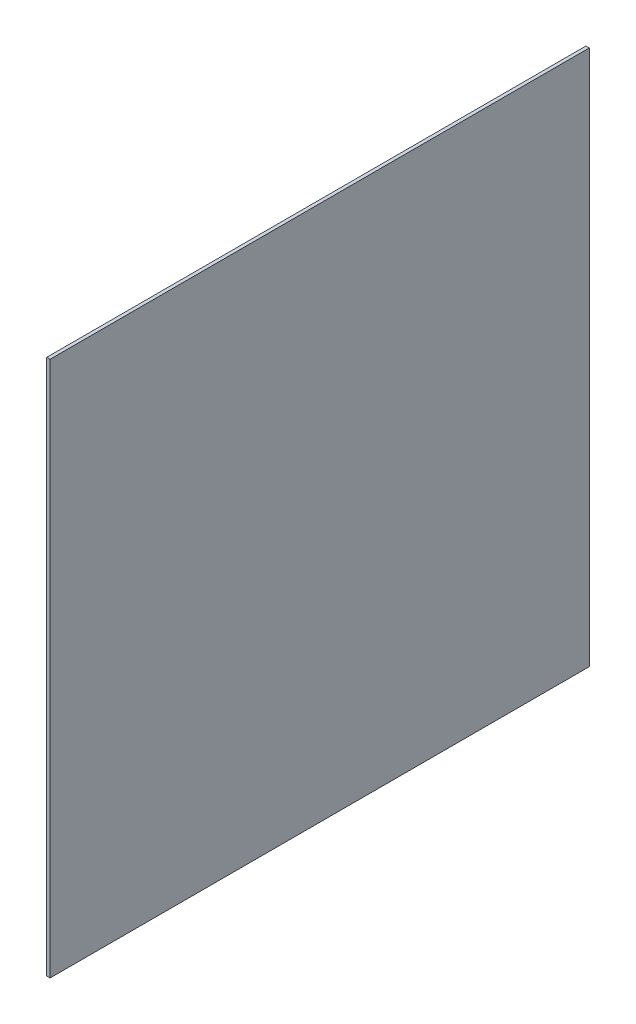
ISO-10303-21;
HEADER;
FILE_DESCRIPTION(('STEP AP214'),'2;1');
FILE_NAME('part.step','',(''),(''),'','','');
FILE_SCHEMA(('AUTOMOTIVE_DESIGN { 1 0 10303 214 1 1 1 1 }'));
ENDSEC;
DATA;
#1=APPLICATION_CONTEXT('core data for automotive mechanical design processes');
#2=APPLICATION_PROTOCOL_DEFINITION('international standard','automotive_design',2000,#1);
#3=PRODUCT_CONTEXT('',#1,'mechanical');
#4=PRODUCT('Part','Part','',(#3));
#5=PRODUCT_RELATED_PRODUCT_CATEGORY('part','',(#4));
#6=PRODUCT_DEFINITION_FORMATION('','',#4);
#7=PRODUCT_DEFINITION_CONTEXT('part definition',#1,'design');
#8=PRODUCT_DEFINITION('design','',#6,#7);
#9=PRODUCT_DEFINITION_SHAPE('','',#8);
#10=(LENGTH_UNIT() NAMED_UNIT(*) SI_UNIT(.MILLI.,.METRE.));
#11=(NAMED_UNIT(*) PLANE_ANGLE_UNIT() SI_UNIT($,.RADIAN.));
#12=(NAMED_UNIT(*) SI_UNIT($,.STERADIAN.) SOLID_ANGLE_UNIT());
#13=UNCERTAINTY_MEASURE_WITH_UNIT(LENGTH_MEASURE(1.E-05),#10,'distance_accuracy_value','');
#14=(GEOMETRIC_REPRESENTATION_CONTEXT(3) GLOBAL_UNCERTAINTY_ASSIGNED_CONTEXT((#13)) GLOBAL_UNIT_ASSIGNED_CONTEXT((#10,
#11,#12)) REPRESENTATION_CONTEXT('',''));
#15=CARTESIAN_POINT('',(0.,0.,0.));
#16=DIRECTION('',(0.,0.,1.));
#17=DIRECTION('',(1.,0.,0.));
#18=AXIS2_PLACEMENT_3D('',#15,#16,#17);
#19=CARTESIAN_POINT('',(1.5875,-254.,-255.5875));
#20=DIRECTION('',(0.,0.,1.));
#21=DIRECTION('',(1.,0.,0.));
#22=AXIS2_PLACEMENT_3D('',#19,#20,#21);
#23=PLANE('',#22);
#24=DIRECTION('',(0.,1.,0.));
#25=VECTOR('',#24,1.);
#26=CARTESIAN_POINT('',(-1.5875,-254.,-255.5875));
#27=LINE('',#26,#25);
#28=CARTESIAN_POINT('',(-1.5875,-254.,-255.5875));
#29=VERTEX_POINT('',#28);
#30=CARTESIAN_POINT('',(-1.5875,254.,-255.5875));
#31=VERTEX_POINT('',#30);
#32=EDGE_CURVE('E100',#29,#31,#27,.T.);
#33=ORIENTED_EDGE('',*,*,#32,.T.);
#34=DIRECTION('',(-1.,0.,0.));
#35=VECTOR('',#34,1.);
#36=CARTESIAN_POINT('',(1.5875,254.,-255.5875));
#37=LINE('',#36,#35);
#38=CARTESIAN_POINT('',(1.5875,254.,-255.5875));
#39=VERTEX_POINT('',#38);
#40=EDGE_CURVE('E11',#39,#31,#37,.T.);
#41=ORIENTED_EDGE('',*,*,#40,.F.);
#42=DIRECTION('',(0.,1.,0.));
#43=VECTOR('',#42,1.);
#44=CARTESIAN_POINT('',(1.5875,-254.,-255.5875));
#45=LINE('',#44,#43);
#46=CARTESIAN_POINT('',(1.5875,-254.,-255.5875));
#47=VERTEX_POINT('',#46);
#48=EDGE_CURVE('E88',#47,#39,#45,.T.);
#49=ORIENTED_EDGE('',*,*,#48,.F.);
#50=DIRECTION('',(-1.,0.,0.));
#51=VECTOR('',#50,1.);
#52=CARTESIAN_POINT('',(1.5875,-254.,-255.5875));
#53=LINE('',#52,#51);
#54=EDGE_CURVE('E96',#47,#29,#53,.T.);
#55=ORIENTED_EDGE('',*,*,#54,.T.);
#56=EDGE_LOOP('',(#33,#41,#49,#55));
#57=FACE_BOUND('',#56,.T.);
#58=ADVANCED_FACE('F37',(#57),#23,.F.);
#59=CARTESIAN_POINT('',(1.5875,254.,255.5875));
#60=DIRECTION('',(0.,-1.,0.));
#61=DIRECTION('',(0.,0.,-1.));
#62=AXIS2_PLACEMENT_3D('',#59,#60,#61);
#63=PLANE('',#62);
#64=DIRECTION('',(0.,0.,1.));
#65=VECTOR('',#64,1.);
#66=CARTESIAN_POINT('',(-1.5875,254.,255.5875));
#67=LINE('',#66,#65);
#68=CARTESIAN_POINT('',(-1.5875,254.,255.5875));
#69=VERTEX_POINT('',#68);
#70=EDGE_CURVE('E92',#31,#69,#67,.T.);
#71=ORIENTED_EDGE('',*,*,#70,.T.);
#72=DIRECTION('',(-1.,0.,0.));
#73=VECTOR('',#72,1.);
#74=CARTESIAN_POINT('',(1.5875,254.,255.5875));
#75=LINE('',#74,#73);
#76=CARTESIAN_POINT('',(1.5875,254.,255.5875));
#77=VERTEX_POINT('',#76);
#78=EDGE_CURVE('E45',#77,#69,#75,.T.);
#79=ORIENTED_EDGE('',*,*,#78,.F.);
#80=DIRECTION('',(0.,0.,1.));
#81=VECTOR('',#80,1.);
#82=CARTESIAN_POINT('',(1.5875,254.,255.5875));
#83=LINE('',#82,#81);
#84=EDGE_CURVE('E83',#39,#77,#83,.T.);
#85=ORIENTED_EDGE('',*,*,#84,.F.);
#86=ORIENTED_EDGE('',*,*,#40,.T.);
#87=EDGE_LOOP('',(#71,#79,#85,#86));
#88=FACE_BOUND('',#87,.T.);
#89=ADVANCED_FACE('F91',(#88),#63,.F.);
#90=CARTESIAN_POINT('',(1.5875,-254.,255.5875));
#91=DIRECTION('',(0.,0.,-1.));
#92=DIRECTION('',(-1.,0.,0.));
#93=AXIS2_PLACEMENT_3D('',#90,#91,#92);
#94=PLANE('',#93);
#95=DIRECTION('',(0.,-1.,0.));
#96=VECTOR('',#95,1.);
#97=CARTESIAN_POINT('',(-1.5875,-254.,255.5875));
#98=LINE('',#97,#96);
#99=CARTESIAN_POINT('',(-1.5875,-254.,255.5875));
#100=VERTEX_POINT('',#99);
#101=EDGE_CURVE('E70',#69,#100,#98,.T.);
#102=ORIENTED_EDGE('',*,*,#101,.T.);
#103=DIRECTION('',(-1.,0.,0.));
#104=VECTOR('',#103,1.);
#105=CARTESIAN_POINT('',(1.5875,-254.,255.5875));
#106=LINE('',#105,#104);
#107=CARTESIAN_POINT('',(1.5875,-254.,255.5875));
#108=VERTEX_POINT('',#107);
#109=EDGE_CURVE('E93',#108,#100,#106,.T.);
#110=ORIENTED_EDGE('',*,*,#109,.F.);
#111=DIRECTION('',(0.,-1.,0.));
#112=VECTOR('',#111,1.);
#113=CARTESIAN_POINT('',(1.5875,-254.,255.5875));
#114=LINE('',#113,#112);
#115=EDGE_CURVE('E86',#77,#108,#114,.T.);
#116=ORIENTED_EDGE('',*,*,#115,.F.);
#117=ORIENTED_EDGE('',*,*,#78,.T.);
#118=EDGE_LOOP('',(#102,#110,#116,#117));
#119=FACE_BOUND('',#118,.T.);
#120=ADVANCED_FACE('F94',(#119),#94,.F.);
#121=CARTESIAN_POINT('',(1.5875,-254.,255.5875));
#122=DIRECTION('',(0.,1.,0.));
#123=DIRECTION('',(0.,0.,1.));
#124=AXIS2_PLACEMENT_3D('',#121,#122,#123);
#125=PLANE('',#124);
#126=DIRECTION('',(0.,0.,-1.));
#127=VECTOR('',#126,1.);
#128=CARTESIAN_POINT('',(-1.5875,-254.,255.5875));
#129=LINE('',#128,#127);
#130=EDGE_CURVE('E76',#100,#29,#129,.T.);
#131=ORIENTED_EDGE('',*,*,#130,.T.);
#132=ORIENTED_EDGE('',*,*,#54,.F.);
#133=DIRECTION('',(0.,0.,-1.));
#134=VECTOR('',#133,1.);
#135=CARTESIAN_POINT('',(1.5875,-254.,255.5875));
#136=LINE('',#135,#134);
#137=EDGE_CURVE('E53',#108,#47,#136,.T.);
#138=ORIENTED_EDGE('',*,*,#137,.F.);
#139=ORIENTED_EDGE('',*,*,#109,.T.);
#140=EDGE_LOOP('',(#131,#132,#138,#139));
#141=FACE_BOUND('',#140,.T.);
#142=ADVANCED_FACE('F107',(#141),#125,.F.);
#143=CARTESIAN_POINT('',(1.5875,0.,0.));
#144=DIRECTION('',(-1.,0.,0.));
#145=DIRECTION('',(0.,0.,1.));
#146=AXIS2_PLACEMENT_3D('',#143,#144,#145);
#147=PLANE('',#146);
#148=ORIENTED_EDGE('',*,*,#48,.T.);
#149=ORIENTED_EDGE('',*,*,#84,.T.);
#150=ORIENTED_EDGE('',*,*,#115,.T.);
#151=ORIENTED_EDGE('',*,*,#137,.T.);
#152=EDGE_LOOP('',(#148,#149,#150,#151));
#153=FACE_BOUND('',#152,.T.);
#154=ADVANCED_FACE('F84',(#153),#147,.F.);
#155=CARTESIAN_POINT('',(-1.5875,0.,0.));
#156=DIRECTION('',(-1.,0.,0.));
#157=DIRECTION('',(0.,0.,1.));
#158=AXIS2_PLACEMENT_3D('',#155,#156,#157);
#159=PLANE('',#158);
#160=ORIENTED_EDGE('',*,*,#32,.F.);
#161=ORIENTED_EDGE('',*,*,#130,.F.);
#162=ORIENTED_EDGE('',*,*,#101,.F.);
#163=ORIENTED_EDGE('',*,*,#70,.F.);
#164=EDGE_LOOP('',(#160,#161,#162,#163));
#165=FACE_BOUND('',#164,.T.);
#166=ADVANCED_FACE('F110',(#165),#159,.T.);
#167=CLOSED_SHELL('',(#58,#89,#120,#142,#154,#166));
#168=MANIFOLD_SOLID_BREP('B2',#167);
#169=ADVANCED_BREP_SHAPE_REPRESENTATION('',(#18,#168),#14);
#170=SHAPE_DEFINITION_REPRESENTATION(#9,#169);
ENDSEC;
END-ISO-10303-21;
